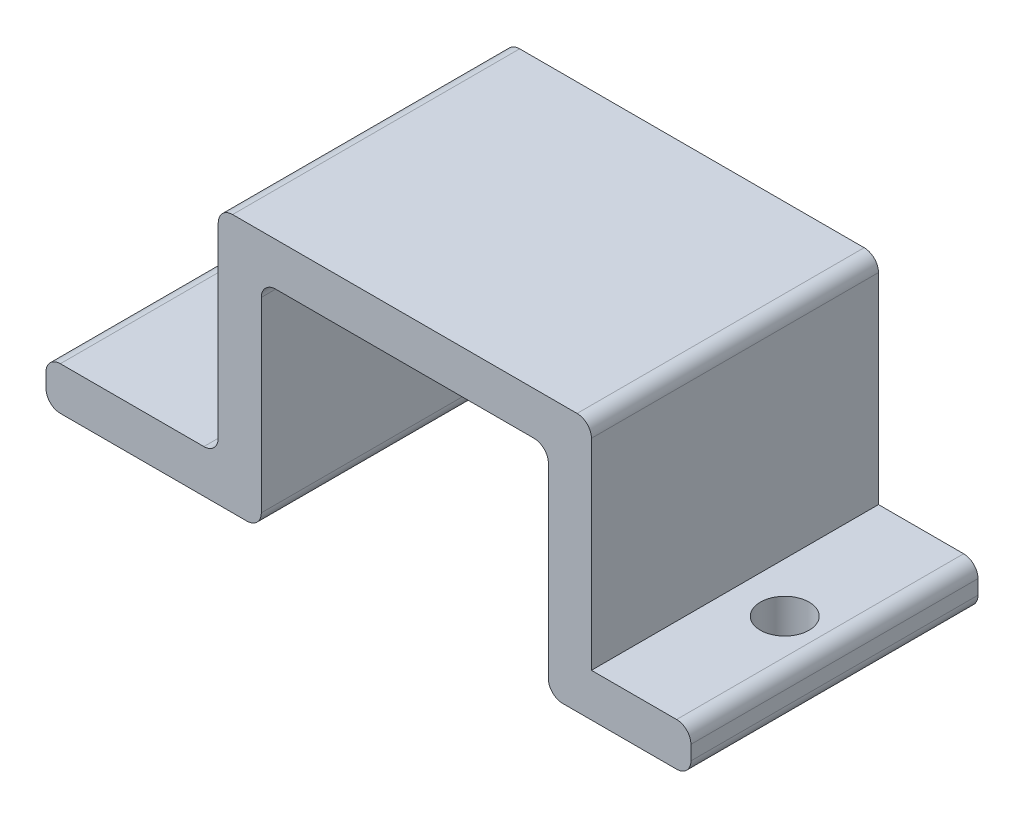
ISO-10303-21;
HEADER;
FILE_DESCRIPTION(('STEP AP214'),'2;1');
FILE_NAME('part.step','',(''),(''),'','','');
FILE_SCHEMA(('AUTOMOTIVE_DESIGN { 1 0 10303 214 1 1 1 1 }'));
ENDSEC;
DATA;
#1=APPLICATION_CONTEXT('core data for automotive mechanical design processes');
#2=APPLICATION_PROTOCOL_DEFINITION('international standard','automotive_design',2000,#1);
#3=PRODUCT_CONTEXT('',#1,'mechanical');
#4=PRODUCT('Part','Part','',(#3));
#5=PRODUCT_RELATED_PRODUCT_CATEGORY('part','',(#4));
#6=PRODUCT_DEFINITION_FORMATION('','',#4);
#7=PRODUCT_DEFINITION_CONTEXT('part definition',#1,'design');
#8=PRODUCT_DEFINITION('design','',#6,#7);
#9=PRODUCT_DEFINITION_SHAPE('','',#8);
#10=(LENGTH_UNIT() NAMED_UNIT(*) SI_UNIT(.MILLI.,.METRE.));
#11=(NAMED_UNIT(*) PLANE_ANGLE_UNIT() SI_UNIT($,.RADIAN.));
#12=(NAMED_UNIT(*) SI_UNIT($,.STERADIAN.) SOLID_ANGLE_UNIT());
#13=UNCERTAINTY_MEASURE_WITH_UNIT(LENGTH_MEASURE(1.E-05),#10,'distance_accuracy_value','');
#14=(GEOMETRIC_REPRESENTATION_CONTEXT(3) GLOBAL_UNCERTAINTY_ASSIGNED_CONTEXT((#13)) GLOBAL_UNIT_ASSIGNED_CONTEXT((#10,
#11,#12)) REPRESENTATION_CONTEXT('',''));
#15=CARTESIAN_POINT('',(0.,0.,0.));
#16=DIRECTION('',(0.,0.,1.));
#17=DIRECTION('',(1.,0.,0.));
#18=AXIS2_PLACEMENT_3D('',#15,#16,#17);
#19=CARTESIAN_POINT('',(0.,18.,20.));
#20=DIRECTION('',(1.,0.,0.));
#21=DIRECTION('',(0.,1.,0.));
#22=AXIS2_PLACEMENT_3D('',#19,#20,#21);
#23=PLANE('',#22);
#24=DIRECTION('',(0.,-1.,0.));
#25=VECTOR('',#24,1.);
#26=CARTESIAN_POINT('',(0.,18.,0.));
#27=LINE('',#26,#25);
#28=CARTESIAN_POINT('',(0.,17.,0.));
#29=VERTEX_POINT('',#28);
#30=CARTESIAN_POINT('',(0.,4.,0.));
#31=VERTEX_POINT('',#30);
#32=EDGE_CURVE('E241',#29,#31,#27,.T.);
#33=ORIENTED_EDGE('',*,*,#32,.T.);
#34=DIRECTION('',(0.,0.,-1.));
#35=VECTOR('',#34,1.);
#36=CARTESIAN_POINT('',(0.,4.,20.));
#37=LINE('',#36,#35);
#38=CARTESIAN_POINT('',(0.,4.,20.));
#39=VERTEX_POINT('',#38);
#40=EDGE_CURVE('E350',#31,#39,#37,.F.);
#41=ORIENTED_EDGE('',*,*,#40,.T.);
#42=DIRECTION('',(0.,-1.,0.));
#43=VECTOR('',#42,1.);
#44=CARTESIAN_POINT('',(0.,18.,20.));
#45=LINE('',#44,#43);
#46=CARTESIAN_POINT('',(0.,17.,20.));
#47=VERTEX_POINT('',#46);
#48=EDGE_CURVE('E253',#47,#39,#45,.T.);
#49=ORIENTED_EDGE('',*,*,#48,.F.);
#50=DIRECTION('',(0.,0.,-1.));
#51=VECTOR('',#50,1.);
#52=CARTESIAN_POINT('',(0.,17.,20.));
#53=LINE('',#52,#51);
#54=EDGE_CURVE('E347',#47,#29,#53,.T.);
#55=ORIENTED_EDGE('',*,*,#54,.T.);
#56=EDGE_LOOP('',(#33,#41,#49,#55));
#57=FACE_BOUND('',#56,.T.);
#58=ADVANCED_FACE('F39',(#57),#23,.F.);
#59=CARTESIAN_POINT('',(26.,0.,20.));
#60=DIRECTION('',(-1.,0.,0.));
#61=DIRECTION('',(0.,0.,1.));
#62=AXIS2_PLACEMENT_3D('',#59,#60,#61);
#63=PLANE('',#62);
#64=DIRECTION('',(0.,1.,0.));
#65=VECTOR('',#64,1.);
#66=CARTESIAN_POINT('',(26.,0.,0.));
#67=LINE('',#66,#65);
#68=CARTESIAN_POINT('',(26.,3.,0.));
#69=VERTEX_POINT('',#68);
#70=CARTESIAN_POINT('',(26.,17.,0.));
#71=VERTEX_POINT('',#70);
#72=EDGE_CURVE('E271',#69,#71,#67,.T.);
#73=ORIENTED_EDGE('',*,*,#72,.T.);
#74=DIRECTION('',(0.,0.,-1.));
#75=VECTOR('',#74,1.);
#76=CARTESIAN_POINT('',(26.,17.,20.));
#77=LINE('',#76,#75);
#78=CARTESIAN_POINT('',(26.,17.,20.));
#79=VERTEX_POINT('',#78);
#80=EDGE_CURVE('E203',#71,#79,#77,.F.);
#81=ORIENTED_EDGE('',*,*,#80,.T.);
#82=DIRECTION('',(0.,1.,0.));
#83=VECTOR('',#82,1.);
#84=CARTESIAN_POINT('',(26.,0.,20.));
#85=LINE('',#84,#83);
#86=CARTESIAN_POINT('',(26.,3.,20.));
#87=VERTEX_POINT('',#86);
#88=EDGE_CURVE('E195',#87,#79,#85,.T.);
#89=ORIENTED_EDGE('',*,*,#88,.F.);
#90=DIRECTION('',(0.,0.,1.));
#91=VECTOR('',#90,1.);
#92=CARTESIAN_POINT('',(26.,3.,0.));
#93=LINE('',#92,#91);
#94=EDGE_CURVE('E200',#69,#87,#93,.T.);
#95=ORIENTED_EDGE('',*,*,#94,.F.);
#96=EDGE_LOOP('',(#73,#81,#89,#95));
#97=FACE_BOUND('',#96,.T.);
#98=ADVANCED_FACE('F198',(#97),#63,.F.);
#99=CARTESIAN_POINT('',(0.,0.,20.));
#100=DIRECTION('',(0.,1.,0.));
#101=DIRECTION('',(0.,0.,1.));
#102=AXIS2_PLACEMENT_3D('',#99,#100,#101);
#103=PLANE('',#102);
#104=CARTESIAN_POINT('',(-6.,0.,10.));
#105=DIRECTION('',(0.,1.,0.));
#106=DIRECTION('',(0.,0.,1.));
#107=AXIS2_PLACEMENT_3D('',#104,#105,#106);
#108=CIRCLE('',#107,1.69999999999999);
#109=CARTESIAN_POINT('',(-6.,0.,11.7));
#110=VERTEX_POINT('',#109);
#111=EDGE_CURVE('E387',#110,#110,#108,.T.);
#112=ORIENTED_EDGE('',*,*,#111,.T.);
#113=EDGE_LOOP('',(#112));
#114=FACE_BOUND('',#113,.T.);
#115=DIRECTION('',(1.,0.,0.));
#116=VECTOR('',#115,1.);
#117=CARTESIAN_POINT('',(0.,0.,0.));
#118=LINE('',#117,#116);
#119=CARTESIAN_POINT('',(-11.,0.,0.));
#120=VERTEX_POINT('',#119);
#121=CARTESIAN_POINT('',(2.,0.,0.));
#122=VERTEX_POINT('',#121);
#123=EDGE_CURVE('E236',#120,#122,#118,.T.);
#124=ORIENTED_EDGE('',*,*,#123,.T.);
#125=DIRECTION('',(0.,0.,-1.));
#126=VECTOR('',#125,1.);
#127=CARTESIAN_POINT('',(2.,0.,20.));
#128=LINE('',#127,#126);
#129=CARTESIAN_POINT('',(2.,0.,20.));
#130=VERTEX_POINT('',#129);
#131=EDGE_CURVE('E335',#122,#130,#128,.F.);
#132=ORIENTED_EDGE('',*,*,#131,.T.);
#133=DIRECTION('',(1.,0.,0.));
#134=VECTOR('',#133,1.);
#135=CARTESIAN_POINT('',(0.,0.,20.));
#136=LINE('',#135,#134);
#137=CARTESIAN_POINT('',(-11.,0.,20.));
#138=VERTEX_POINT('',#137);
#139=EDGE_CURVE('E237',#138,#130,#136,.T.);
#140=ORIENTED_EDGE('',*,*,#139,.F.);
#141=DIRECTION('',(0.,0.,1.));
#142=VECTOR('',#141,1.);
#143=CARTESIAN_POINT('',(-11.,0.,20.));
#144=LINE('',#143,#142);
#145=EDGE_CURVE('E333',#138,#120,#144,.F.);
#146=ORIENTED_EDGE('',*,*,#145,.T.);
#147=EDGE_LOOP('',(#124,#132,#140,#146));
#148=FACE_BOUND('',#147,.T.);
#149=ADVANCED_FACE('F421',(#114,#148),#103,.F.);
#150=CARTESIAN_POINT('',(3.,0.,20.));
#151=DIRECTION('',(-1.,0.,0.));
#152=DIRECTION('',(0.,0.,1.));
#153=AXIS2_PLACEMENT_3D('',#150,#151,#152);
#154=PLANE('',#153);
#155=DIRECTION('',(0.,1.,0.));
#156=VECTOR('',#155,1.);
#157=CARTESIAN_POINT('',(3.,0.,0.));
#158=LINE('',#157,#156);
#159=CARTESIAN_POINT('',(3.,1.,0.));
#160=VERTEX_POINT('',#159);
#161=CARTESIAN_POINT('',(3.,14.,0.));
#162=VERTEX_POINT('',#161);
#163=EDGE_CURVE('E259',#160,#162,#158,.T.);
#164=ORIENTED_EDGE('',*,*,#163,.T.);
#165=DIRECTION('',(0.,0.,-1.));
#166=VECTOR('',#165,1.);
#167=CARTESIAN_POINT('',(3.,14.,20.));
#168=LINE('',#167,#166);
#169=CARTESIAN_POINT('',(3.,14.,20.));
#170=VERTEX_POINT('',#169);
#171=EDGE_CURVE('E326',#162,#170,#168,.F.);
#172=ORIENTED_EDGE('',*,*,#171,.T.);
#173=DIRECTION('',(0.,1.,0.));
#174=VECTOR('',#173,1.);
#175=CARTESIAN_POINT('',(3.,0.,20.));
#176=LINE('',#175,#174);
#177=CARTESIAN_POINT('',(3.,1.,20.));
#178=VERTEX_POINT('',#177);
#179=EDGE_CURVE('E240',#178,#170,#176,.T.);
#180=ORIENTED_EDGE('',*,*,#179,.F.);
#181=DIRECTION('',(0.,0.,-1.));
#182=VECTOR('',#181,1.);
#183=CARTESIAN_POINT('',(3.,1.,20.));
#184=LINE('',#183,#182);
#185=EDGE_CURVE('E323',#178,#160,#184,.T.);
#186=ORIENTED_EDGE('',*,*,#185,.T.);
#187=EDGE_LOOP('',(#164,#172,#180,#186));
#188=FACE_BOUND('',#187,.T.);
#189=ADVANCED_FACE('F441',(#188),#154,.F.);
#190=CARTESIAN_POINT('',(3.,15.,20.));
#191=DIRECTION('',(0.,1.,0.));
#192=DIRECTION('',(0.,0.,1.));
#193=AXIS2_PLACEMENT_3D('',#190,#191,#192);
#194=PLANE('',#193);
#195=DIRECTION('',(1.,0.,0.));
#196=VECTOR('',#195,1.);
#197=CARTESIAN_POINT('',(3.,15.,20.));
#198=LINE('',#197,#196);
#199=CARTESIAN_POINT('',(4.,15.,20.));
#200=VERTEX_POINT('',#199);
#201=CARTESIAN_POINT('',(22.,15.,20.));
#202=VERTEX_POINT('',#201);
#203=EDGE_CURVE('E244',#200,#202,#198,.T.);
#204=ORIENTED_EDGE('',*,*,#203,.F.);
#205=DIRECTION('',(0.,0.,-1.));
#206=VECTOR('',#205,1.);
#207=CARTESIAN_POINT('',(4.,15.,0.));
#208=LINE('',#207,#206);
#209=CARTESIAN_POINT('',(4.,15.,0.));
#210=VERTEX_POINT('',#209);
#211=EDGE_CURVE('E320',#200,#210,#208,.T.);
#212=ORIENTED_EDGE('',*,*,#211,.T.);
#213=DIRECTION('',(1.,0.,0.));
#214=VECTOR('',#213,1.);
#215=CARTESIAN_POINT('',(3.,15.,0.));
#216=LINE('',#215,#214);
#217=CARTESIAN_POINT('',(22.,15.,0.));
#218=VERTEX_POINT('',#217);
#219=EDGE_CURVE('E262',#210,#218,#216,.T.);
#220=ORIENTED_EDGE('',*,*,#219,.T.);
#221=DIRECTION('',(0.,0.,-1.));
#222=VECTOR('',#221,1.);
#223=CARTESIAN_POINT('',(22.,15.,20.));
#224=LINE('',#223,#222);
#225=EDGE_CURVE('E318',#218,#202,#224,.F.);
#226=ORIENTED_EDGE('',*,*,#225,.T.);
#227=EDGE_LOOP('',(#204,#212,#220,#226));
#228=FACE_BOUND('',#227,.T.);
#229=ADVANCED_FACE('F437',(#228),#194,.F.);
#230=CARTESIAN_POINT('',(23.,15.,20.));
#231=DIRECTION('',(1.,0.,0.));
#232=DIRECTION('',(0.,0.,-1.));
#233=AXIS2_PLACEMENT_3D('',#230,#231,#232);
#234=PLANE('',#233);
#235=DIRECTION('',(0.,-1.,0.));
#236=VECTOR('',#235,1.);
#237=CARTESIAN_POINT('',(23.,15.,20.));
#238=LINE('',#237,#236);
#239=CARTESIAN_POINT('',(23.,14.,20.));
#240=VERTEX_POINT('',#239);
#241=CARTESIAN_POINT('',(23.,1.,20.));
#242=VERTEX_POINT('',#241);
#243=EDGE_CURVE('E247',#240,#242,#238,.T.);
#244=ORIENTED_EDGE('',*,*,#243,.F.);
#245=DIRECTION('',(0.,0.,-1.));
#246=VECTOR('',#245,1.);
#247=CARTESIAN_POINT('',(23.,14.,0.));
#248=LINE('',#247,#246);
#249=CARTESIAN_POINT('',(23.,14.,0.));
#250=VERTEX_POINT('',#249);
#251=EDGE_CURVE('E330',#240,#250,#248,.T.);
#252=ORIENTED_EDGE('',*,*,#251,.T.);
#253=DIRECTION('',(0.,-1.,0.));
#254=VECTOR('',#253,1.);
#255=CARTESIAN_POINT('',(23.,15.,0.));
#256=LINE('',#255,#254);
#257=CARTESIAN_POINT('',(23.,1.,0.));
#258=VERTEX_POINT('',#257);
#259=EDGE_CURVE('E265',#250,#258,#256,.T.);
#260=ORIENTED_EDGE('',*,*,#259,.T.);
#261=DIRECTION('',(0.,0.,-1.));
#262=VECTOR('',#261,1.);
#263=CARTESIAN_POINT('',(23.,1.,20.));
#264=LINE('',#263,#262);
#265=EDGE_CURVE('E328',#258,#242,#264,.F.);
#266=ORIENTED_EDGE('',*,*,#265,.T.);
#267=EDGE_LOOP('',(#244,#252,#260,#266));
#268=FACE_BOUND('',#267,.T.);
#269=ADVANCED_FACE('F433',(#268),#234,.F.);
#270=CARTESIAN_POINT('',(23.,0.,20.));
#271=DIRECTION('',(0.,1.,0.));
#272=DIRECTION('',(0.,0.,1.));
#273=AXIS2_PLACEMENT_3D('',#270,#271,#272);
#274=PLANE('',#273);
#275=CARTESIAN_POINT('',(29.4658367165777,0.,10.));
#276=DIRECTION('',(0.,1.,0.));
#277=DIRECTION('',(0.,0.,1.));
#278=AXIS2_PLACEMENT_3D('',#275,#276,#277);
#279=CIRCLE('',#278,1.7);
#280=CARTESIAN_POINT('',(29.4658367165777,0.,11.7));
#281=VERTEX_POINT('',#280);
#282=EDGE_CURVE('E393',#281,#281,#279,.T.);
#283=ORIENTED_EDGE('',*,*,#282,.T.);
#284=EDGE_LOOP('',(#283));
#285=FACE_BOUND('',#284,.T.);
#286=DIRECTION('',(1.,0.,0.));
#287=VECTOR('',#286,1.);
#288=CARTESIAN_POINT('',(23.,0.,0.));
#289=LINE('',#288,#287);
#290=CARTESIAN_POINT('',(24.,0.,0.));
#291=VERTEX_POINT('',#290);
#292=CARTESIAN_POINT('',(31.9316734331555,0.,0.));
#293=VERTEX_POINT('',#292);
#294=EDGE_CURVE('E268',#291,#293,#289,.T.);
#295=ORIENTED_EDGE('',*,*,#294,.T.);
#296=DIRECTION('',(0.,0.,-1.));
#297=VECTOR('',#296,1.);
#298=CARTESIAN_POINT('',(31.9316734331555,0.,20.));
#299=LINE('',#298,#297);
#300=CARTESIAN_POINT('',(31.9316734331555,0.,20.));
#301=VERTEX_POINT('',#300);
#302=EDGE_CURVE('E301',#293,#301,#299,.F.);
#303=ORIENTED_EDGE('',*,*,#302,.T.);
#304=DIRECTION('',(1.,0.,0.));
#305=VECTOR('',#304,1.);
#306=CARTESIAN_POINT('',(23.,0.,20.));
#307=LINE('',#306,#305);
#308=CARTESIAN_POINT('',(24.,0.,20.));
#309=VERTEX_POINT('',#308);
#310=EDGE_CURVE('E206',#309,#301,#307,.T.);
#311=ORIENTED_EDGE('',*,*,#310,.F.);
#312=DIRECTION('',(0.,0.,-1.));
#313=VECTOR('',#312,1.);
#314=CARTESIAN_POINT('',(24.,0.,20.));
#315=LINE('',#314,#313);
#316=EDGE_CURVE('E298',#309,#291,#315,.T.);
#317=ORIENTED_EDGE('',*,*,#316,.T.);
#318=EDGE_LOOP('',(#295,#303,#311,#317));
#319=FACE_BOUND('',#318,.T.);
#320=ADVANCED_FACE('F428',(#285,#319),#274,.F.);
#321=CARTESIAN_POINT('',(26.,18.,20.));
#322=DIRECTION('',(0.,-1.,0.));
#323=DIRECTION('',(1.,0.,0.));
#324=AXIS2_PLACEMENT_3D('',#321,#322,#323);
#325=PLANE('',#324);
#326=DIRECTION('',(-1.,0.,0.));
#327=VECTOR('',#326,1.);
#328=CARTESIAN_POINT('',(26.,18.,0.));
#329=LINE('',#328,#327);
#330=CARTESIAN_POINT('',(25.,18.,0.));
#331=VERTEX_POINT('',#330);
#332=CARTESIAN_POINT('',(1.,18.,0.));
#333=VERTEX_POINT('',#332);
#334=EDGE_CURVE('E273',#331,#333,#329,.T.);
#335=ORIENTED_EDGE('',*,*,#334,.T.);
#336=DIRECTION('',(0.,0.,-1.));
#337=VECTOR('',#336,1.);
#338=CARTESIAN_POINT('',(1.,18.,20.));
#339=LINE('',#338,#337);
#340=CARTESIAN_POINT('',(1.,18.,20.));
#341=VERTEX_POINT('',#340);
#342=EDGE_CURVE('E355',#333,#341,#339,.F.);
#343=ORIENTED_EDGE('',*,*,#342,.T.);
#344=DIRECTION('',(-1.,0.,0.));
#345=VECTOR('',#344,1.);
#346=CARTESIAN_POINT('',(26.,18.,20.));
#347=LINE('',#346,#345);
#348=CARTESIAN_POINT('',(25.,18.,20.));
#349=VERTEX_POINT('',#348);
#350=EDGE_CURVE('E205',#349,#341,#347,.T.);
#351=ORIENTED_EDGE('',*,*,#350,.F.);
#352=DIRECTION('',(0.,0.,-1.));
#353=VECTOR('',#352,1.);
#354=CARTESIAN_POINT('',(25.,18.,20.));
#355=LINE('',#354,#353);
#356=EDGE_CURVE('E352',#349,#331,#355,.T.);
#357=ORIENTED_EDGE('',*,*,#356,.T.);
#358=EDGE_LOOP('',(#335,#343,#351,#357));
#359=FACE_BOUND('',#358,.T.);
#360=ADVANCED_FACE('F426',(#359),#325,.F.);
#361=CARTESIAN_POINT('',(0.,0.,20.));
#362=DIRECTION('',(0.,0.,1.));
#363=DIRECTION('',(1.,0.,0.));
#364=AXIS2_PLACEMENT_3D('',#361,#362,#363);
#365=PLANE('',#364);
#366=ORIENTED_EDGE('',*,*,#310,.T.);
#367=CARTESIAN_POINT('',(31.9316734331555,1.,20.));
#368=DIRECTION('',(0.,0.,1.));
#369=DIRECTION('',(1.,0.,0.));
#370=AXIS2_PLACEMENT_3D('',#367,#368,#369);
#371=CIRCLE('',#370,1.);
#372=CARTESIAN_POINT('',(32.9316734331555,1.,20.));
#373=VERTEX_POINT('',#372);
#374=EDGE_CURVE('E314',#301,#373,#371,.T.);
#375=ORIENTED_EDGE('',*,*,#374,.T.);
#376=DIRECTION('',(0.,-1.,0.));
#377=VECTOR('',#376,1.);
#378=CARTESIAN_POINT('',(32.9316734331555,3.,20.));
#379=LINE('',#378,#377);
#380=CARTESIAN_POINT('',(32.9316734331555,2.,20.));
#381=VERTEX_POINT('',#380);
#382=EDGE_CURVE('E233',#381,#373,#379,.T.);
#383=ORIENTED_EDGE('',*,*,#382,.F.);
#384=CARTESIAN_POINT('',(31.9316734331555,2.,20.));
#385=DIRECTION('',(0.,0.,1.));
#386=DIRECTION('',(1.,0.,0.));
#387=AXIS2_PLACEMENT_3D('',#384,#385,#386);
#388=CIRCLE('',#387,1.);
#389=CARTESIAN_POINT('',(31.9316734331555,3.,20.));
#390=VERTEX_POINT('',#389);
#391=EDGE_CURVE('E214',#381,#390,#388,.T.);
#392=ORIENTED_EDGE('',*,*,#391,.T.);
#393=DIRECTION('',(1.,0.,0.));
#394=VECTOR('',#393,1.);
#395=CARTESIAN_POINT('',(26.,3.,20.));
#396=LINE('',#395,#394);
#397=EDGE_CURVE('E209',#87,#390,#396,.T.);
#398=ORIENTED_EDGE('',*,*,#397,.F.);
#399=ORIENTED_EDGE('',*,*,#88,.T.);
#400=CARTESIAN_POINT('',(25.,17.,20.));
#401=DIRECTION('',(0.,0.,1.));
#402=DIRECTION('',(1.,0.,0.));
#403=AXIS2_PLACEMENT_3D('',#400,#401,#402);
#404=CIRCLE('',#403,1.);
#405=EDGE_CURVE('E303',#79,#349,#404,.T.);
#406=ORIENTED_EDGE('',*,*,#405,.T.);
#407=ORIENTED_EDGE('',*,*,#350,.T.);
#408=CARTESIAN_POINT('',(1.,17.,20.));
#409=DIRECTION('',(0.,0.,1.));
#410=DIRECTION('',(1.,0.,0.));
#411=AXIS2_PLACEMENT_3D('',#408,#409,#410);
#412=CIRCLE('',#411,1.);
#413=EDGE_CURVE('E305',#341,#47,#412,.T.);
#414=ORIENTED_EDGE('',*,*,#413,.T.);
#415=ORIENTED_EDGE('',*,*,#48,.T.);
#416=CARTESIAN_POINT('',(-1.,4.,20.));
#417=DIRECTION('',(0.,0.,1.));
#418=DIRECTION('',(1.,0.,0.));
#419=AXIS2_PLACEMENT_3D('',#416,#417,#418);
#420=CIRCLE('',#419,1.);
#421=CARTESIAN_POINT('',(-1.,3.,20.));
#422=VERTEX_POINT('',#421);
#423=EDGE_CURVE('E11',#39,#422,#420,.F.);
#424=ORIENTED_EDGE('',*,*,#423,.T.);
#425=DIRECTION('',(1.,0.,0.));
#426=VECTOR('',#425,1.);
#427=CARTESIAN_POINT('',(0.,3.,20.));
#428=LINE('',#427,#426);
#429=CARTESIAN_POINT('',(-11.,3.,20.));
#430=VERTEX_POINT('',#429);
#431=EDGE_CURVE('E225',#430,#422,#428,.T.);
#432=ORIENTED_EDGE('',*,*,#431,.F.);
#433=CARTESIAN_POINT('',(-11.,2.,20.));
#434=DIRECTION('',(0.,0.,1.));
#435=DIRECTION('',(1.,0.,0.));
#436=AXIS2_PLACEMENT_3D('',#433,#434,#435);
#437=CIRCLE('',#436,1.);
#438=CARTESIAN_POINT('',(-12.,2.,20.));
#439=VERTEX_POINT('',#438);
#440=EDGE_CURVE('E62',#430,#439,#437,.T.);
#441=ORIENTED_EDGE('',*,*,#440,.T.);
#442=DIRECTION('',(0.,-1.,0.));
#443=VECTOR('',#442,1.);
#444=CARTESIAN_POINT('',(-12.,3.,20.));
#445=LINE('',#444,#443);
#446=CARTESIAN_POINT('',(-12.,1.,20.));
#447=VERTEX_POINT('',#446);
#448=EDGE_CURVE('E381',#439,#447,#445,.T.);
#449=ORIENTED_EDGE('',*,*,#448,.T.);
#450=CARTESIAN_POINT('',(-11.,1.,20.));
#451=DIRECTION('',(0.,0.,1.));
#452=DIRECTION('',(1.,0.,0.));
#453=AXIS2_PLACEMENT_3D('',#450,#451,#452);
#454=CIRCLE('',#453,1.);
#455=EDGE_CURVE('E54',#447,#138,#454,.T.);
#456=ORIENTED_EDGE('',*,*,#455,.T.);
#457=ORIENTED_EDGE('',*,*,#139,.T.);
#458=CARTESIAN_POINT('',(2.,1.,20.));
#459=DIRECTION('',(0.,0.,1.));
#460=DIRECTION('',(1.,0.,0.));
#461=AXIS2_PLACEMENT_3D('',#458,#459,#460);
#462=CIRCLE('',#461,1.);
#463=EDGE_CURVE('E311',#130,#178,#462,.T.);
#464=ORIENTED_EDGE('',*,*,#463,.T.);
#465=ORIENTED_EDGE('',*,*,#179,.T.);
#466=CARTESIAN_POINT('',(4.,14.,20.));
#467=DIRECTION('',(0.,0.,1.));
#468=DIRECTION('',(1.,0.,0.));
#469=AXIS2_PLACEMENT_3D('',#466,#467,#468);
#470=CIRCLE('',#469,1.);
#471=EDGE_CURVE('E360',#170,#200,#470,.F.);
#472=ORIENTED_EDGE('',*,*,#471,.T.);
#473=ORIENTED_EDGE('',*,*,#203,.T.);
#474=CARTESIAN_POINT('',(22.,14.,20.));
#475=DIRECTION('',(0.,0.,1.));
#476=DIRECTION('',(1.,0.,0.));
#477=AXIS2_PLACEMENT_3D('',#474,#475,#476);
#478=CIRCLE('',#477,1.);
#479=EDGE_CURVE('E364',#202,#240,#478,.F.);
#480=ORIENTED_EDGE('',*,*,#479,.T.);
#481=ORIENTED_EDGE('',*,*,#243,.T.);
#482=CARTESIAN_POINT('',(24.,1.,20.));
#483=DIRECTION('',(0.,0.,1.));
#484=DIRECTION('',(1.,0.,0.));
#485=AXIS2_PLACEMENT_3D('',#482,#483,#484);
#486=CIRCLE('',#485,1.);
#487=EDGE_CURVE('E307',#242,#309,#486,.T.);
#488=ORIENTED_EDGE('',*,*,#487,.T.);
#489=EDGE_LOOP('',(#366,#375,#383,#392,#398,#399,#406,#407,#414,#415,#424,#432,#441,#449,#456,
#457,#464,#465,#472,#473,#480,#481,#488));
#490=FACE_BOUND('',#489,.T.);
#491=ADVANCED_FACE('F211',(#490),#365,.T.);
#492=CARTESIAN_POINT('',(0.,0.,0.));
#493=DIRECTION('',(0.,0.,1.));
#494=DIRECTION('',(1.,0.,0.));
#495=AXIS2_PLACEMENT_3D('',#492,#493,#494);
#496=PLANE('',#495);
#497=DIRECTION('',(0.,-1.,0.));
#498=VECTOR('',#497,1.);
#499=CARTESIAN_POINT('',(32.9316734331555,3.,0.));
#500=LINE('',#499,#498);
#501=CARTESIAN_POINT('',(32.9316734331555,2.,0.));
#502=VERTEX_POINT('',#501);
#503=CARTESIAN_POINT('',(32.9316734331555,1.,0.));
#504=VERTEX_POINT('',#503);
#505=EDGE_CURVE('E230',#502,#504,#500,.T.);
#506=ORIENTED_EDGE('',*,*,#505,.T.);
#507=CARTESIAN_POINT('',(31.9316734331555,1.,0.));
#508=DIRECTION('',(0.,0.,1.));
#509=DIRECTION('',(1.,0.,0.));
#510=AXIS2_PLACEMENT_3D('',#507,#508,#509);
#511=CIRCLE('',#510,1.);
#512=EDGE_CURVE('E296',#504,#293,#511,.F.);
#513=ORIENTED_EDGE('',*,*,#512,.T.);
#514=ORIENTED_EDGE('',*,*,#294,.F.);
#515=CARTESIAN_POINT('',(24.,1.,0.));
#516=DIRECTION('',(0.,0.,1.));
#517=DIRECTION('',(1.,0.,0.));
#518=AXIS2_PLACEMENT_3D('',#515,#516,#517);
#519=CIRCLE('',#518,1.);
#520=EDGE_CURVE('E286',#291,#258,#519,.F.);
#521=ORIENTED_EDGE('',*,*,#520,.T.);
#522=ORIENTED_EDGE('',*,*,#259,.F.);
#523=CARTESIAN_POINT('',(22.,14.,0.));
#524=DIRECTION('',(0.,0.,1.));
#525=DIRECTION('',(1.,0.,0.));
#526=AXIS2_PLACEMENT_3D('',#523,#524,#525);
#527=CIRCLE('',#526,1.);
#528=EDGE_CURVE('E362',#250,#218,#527,.T.);
#529=ORIENTED_EDGE('',*,*,#528,.T.);
#530=ORIENTED_EDGE('',*,*,#219,.F.);
#531=CARTESIAN_POINT('',(4.,14.,0.));
#532=DIRECTION('',(0.,0.,1.));
#533=DIRECTION('',(1.,0.,0.));
#534=AXIS2_PLACEMENT_3D('',#531,#532,#533);
#535=CIRCLE('',#534,1.);
#536=EDGE_CURVE('E358',#210,#162,#535,.T.);
#537=ORIENTED_EDGE('',*,*,#536,.T.);
#538=ORIENTED_EDGE('',*,*,#163,.F.);
#539=CARTESIAN_POINT('',(2.,1.,0.));
#540=DIRECTION('',(0.,0.,1.));
#541=DIRECTION('',(1.,0.,0.));
#542=AXIS2_PLACEMENT_3D('',#539,#540,#541);
#543=CIRCLE('',#542,1.);
#544=EDGE_CURVE('E292',#160,#122,#543,.F.);
#545=ORIENTED_EDGE('',*,*,#544,.T.);
#546=ORIENTED_EDGE('',*,*,#123,.F.);
#547=CARTESIAN_POINT('',(-11.,1.,0.));
#548=DIRECTION('',(0.,0.,1.));
#549=DIRECTION('',(1.,0.,0.));
#550=AXIS2_PLACEMENT_3D('',#547,#548,#549);
#551=CIRCLE('',#550,1.);
#552=CARTESIAN_POINT('',(-12.,1.,0.));
#553=VERTEX_POINT('',#552);
#554=EDGE_CURVE('E290',#120,#553,#551,.F.);
#555=ORIENTED_EDGE('',*,*,#554,.T.);
#556=DIRECTION('',(0.,-1.,0.));
#557=VECTOR('',#556,1.);
#558=CARTESIAN_POINT('',(-12.,3.,0.));
#559=LINE('',#558,#557);
#560=CARTESIAN_POINT('',(-12.,2.,0.));
#561=VERTEX_POINT('',#560);
#562=EDGE_CURVE('E382',#561,#553,#559,.T.);
#563=ORIENTED_EDGE('',*,*,#562,.F.);
#564=CARTESIAN_POINT('',(-11.,2.,0.));
#565=DIRECTION('',(0.,0.,1.));
#566=DIRECTION('',(1.,0.,0.));
#567=AXIS2_PLACEMENT_3D('',#564,#565,#566);
#568=CIRCLE('',#567,1.);
#569=CARTESIAN_POINT('',(-11.,3.,0.));
#570=VERTEX_POINT('',#569);
#571=EDGE_CURVE('E288',#561,#570,#568,.F.);
#572=ORIENTED_EDGE('',*,*,#571,.T.);
#573=DIRECTION('',(-1.,0.,0.));
#574=VECTOR('',#573,1.);
#575=CARTESIAN_POINT('',(0.,3.,0.));
#576=LINE('',#575,#574);
#577=CARTESIAN_POINT('',(-1.,3.,0.));
#578=VERTEX_POINT('',#577);
#579=EDGE_CURVE('E222',#578,#570,#576,.T.);
#580=ORIENTED_EDGE('',*,*,#579,.F.);
#581=CARTESIAN_POINT('',(-1.,4.,0.));
#582=DIRECTION('',(0.,0.,1.));
#583=DIRECTION('',(1.,0.,0.));
#584=AXIS2_PLACEMENT_3D('',#581,#582,#583);
#585=CIRCLE('',#584,1.);
#586=EDGE_CURVE('E47',#578,#31,#585,.T.);
#587=ORIENTED_EDGE('',*,*,#586,.T.);
#588=ORIENTED_EDGE('',*,*,#32,.F.);
#589=CARTESIAN_POINT('',(1.,17.,0.));
#590=DIRECTION('',(0.,0.,1.));
#591=DIRECTION('',(1.,0.,0.));
#592=AXIS2_PLACEMENT_3D('',#589,#590,#591);
#593=CIRCLE('',#592,1.);
#594=EDGE_CURVE('E284',#29,#333,#593,.F.);
#595=ORIENTED_EDGE('',*,*,#594,.T.);
#596=ORIENTED_EDGE('',*,*,#334,.F.);
#597=CARTESIAN_POINT('',(25.,17.,0.));
#598=DIRECTION('',(0.,0.,1.));
#599=DIRECTION('',(1.,0.,0.));
#600=AXIS2_PLACEMENT_3D('',#597,#598,#599);
#601=CIRCLE('',#600,1.);
#602=EDGE_CURVE('E282',#331,#71,#601,.F.);
#603=ORIENTED_EDGE('',*,*,#602,.T.);
#604=ORIENTED_EDGE('',*,*,#72,.F.);
#605=DIRECTION('',(-1.,0.,0.));
#606=VECTOR('',#605,1.);
#607=CARTESIAN_POINT('',(26.,3.,0.));
#608=LINE('',#607,#606);
#609=CARTESIAN_POINT('',(31.9316734331555,3.,0.));
#610=VERTEX_POINT('',#609);
#611=EDGE_CURVE('E218',#610,#69,#608,.T.);
#612=ORIENTED_EDGE('',*,*,#611,.F.);
#613=CARTESIAN_POINT('',(31.9316734331555,2.,0.));
#614=DIRECTION('',(0.,0.,1.));
#615=DIRECTION('',(1.,0.,0.));
#616=AXIS2_PLACEMENT_3D('',#613,#614,#615);
#617=CIRCLE('',#616,1.);
#618=EDGE_CURVE('E294',#610,#502,#617,.F.);
#619=ORIENTED_EDGE('',*,*,#618,.T.);
#620=EDGE_LOOP('',(#506,#513,#514,#521,#522,#529,#530,#537,#538,#545,#546,#555,#563,#572,#580,
#587,#588,#595,#596,#603,#604,#612,#619));
#621=FACE_BOUND('',#620,.T.);
#622=ADVANCED_FACE('F368',(#621),#496,.F.);
#623=CARTESIAN_POINT('',(32.9316734331555,3.,0.));
#624=DIRECTION('',(-1.,0.,0.));
#625=DIRECTION('',(0.,0.,1.));
#626=AXIS2_PLACEMENT_3D('',#623,#624,#625);
#627=PLANE('',#626);
#628=ORIENTED_EDGE('',*,*,#382,.T.);
#629=DIRECTION('',(0.,0.,-1.));
#630=VECTOR('',#629,1.);
#631=CARTESIAN_POINT('',(32.9316734331555,1.,0.));
#632=LINE('',#631,#630);
#633=EDGE_CURVE('E279',#373,#504,#632,.T.);
#634=ORIENTED_EDGE('',*,*,#633,.T.);
#635=ORIENTED_EDGE('',*,*,#505,.F.);
#636=DIRECTION('',(0.,0.,-1.));
#637=VECTOR('',#636,1.);
#638=CARTESIAN_POINT('',(32.9316734331555,2.,20.));
#639=LINE('',#638,#637);
#640=EDGE_CURVE('E256',#502,#381,#639,.F.);
#641=ORIENTED_EDGE('',*,*,#640,.T.);
#642=EDGE_LOOP('',(#628,#634,#635,#641));
#643=FACE_BOUND('',#642,.T.);
#644=ADVANCED_FACE('F404',(#643),#627,.F.);
#645=CARTESIAN_POINT('',(0.,3.,0.));
#646=DIRECTION('',(0.,1.,0.));
#647=DIRECTION('',(0.,0.,1.));
#648=AXIS2_PLACEMENT_3D('',#645,#646,#647);
#649=PLANE('',#648);
#650=CARTESIAN_POINT('',(29.4658367165777,3.,10.));
#651=DIRECTION('',(0.,1.,0.));
#652=DIRECTION('',(0.,0.,1.));
#653=AXIS2_PLACEMENT_3D('',#650,#651,#652);
#654=CIRCLE('',#653,1.69999999999999);
#655=CARTESIAN_POINT('',(29.4658367165777,3.,11.7));
#656=VERTEX_POINT('',#655);
#657=EDGE_CURVE('E396',#656,#656,#654,.T.);
#658=ORIENTED_EDGE('',*,*,#657,.F.);
#659=EDGE_LOOP('',(#658));
#660=FACE_BOUND('',#659,.T.);
#661=ORIENTED_EDGE('',*,*,#397,.T.);
#662=DIRECTION('',(0.,0.,-1.));
#663=VECTOR('',#662,1.);
#664=CARTESIAN_POINT('',(31.9316734331555,3.,0.));
#665=LINE('',#664,#663);
#666=EDGE_CURVE('E316',#390,#610,#665,.T.);
#667=ORIENTED_EDGE('',*,*,#666,.T.);
#668=ORIENTED_EDGE('',*,*,#611,.T.);
#669=ORIENTED_EDGE('',*,*,#94,.T.);
#670=EDGE_LOOP('',(#661,#667,#668,#669));
#671=FACE_BOUND('',#670,.T.);
#672=ADVANCED_FACE('F220',(#660,#671),#649,.T.);
#673=CARTESIAN_POINT('',(-12.,3.,20.));
#674=DIRECTION('',(1.,0.,0.));
#675=DIRECTION('',(0.,0.,-1.));
#676=AXIS2_PLACEMENT_3D('',#673,#674,#675);
#677=PLANE('',#676);
#678=ORIENTED_EDGE('',*,*,#562,.T.);
#679=DIRECTION('',(0.,0.,1.));
#680=VECTOR('',#679,1.);
#681=CARTESIAN_POINT('',(-12.,1.,20.));
#682=LINE('',#681,#680);
#683=EDGE_CURVE('E339',#553,#447,#682,.T.);
#684=ORIENTED_EDGE('',*,*,#683,.T.);
#685=ORIENTED_EDGE('',*,*,#448,.F.);
#686=DIRECTION('',(0.,0.,1.));
#687=VECTOR('',#686,1.);
#688=CARTESIAN_POINT('',(-12.,2.,0.));
#689=LINE('',#688,#687);
#690=EDGE_CURVE('E337',#439,#561,#689,.F.);
#691=ORIENTED_EDGE('',*,*,#690,.T.);
#692=EDGE_LOOP('',(#678,#684,#685,#691));
#693=FACE_BOUND('',#692,.T.);
#694=ADVANCED_FACE('F403',(#693),#677,.F.);
#695=CARTESIAN_POINT('',(0.,3.,0.));
#696=DIRECTION('',(0.,1.,0.));
#697=DIRECTION('',(0.,0.,1.));
#698=AXIS2_PLACEMENT_3D('',#695,#696,#697);
#699=PLANE('',#698);
#700=CARTESIAN_POINT('',(-6.,3.,10.));
#701=DIRECTION('',(0.,1.,0.));
#702=DIRECTION('',(0.,0.,1.));
#703=AXIS2_PLACEMENT_3D('',#700,#701,#702);
#704=CIRCLE('',#703,1.69999999999999);
#705=CARTESIAN_POINT('',(-6.,3.,11.7));
#706=VERTEX_POINT('',#705);
#707=EDGE_CURVE('E390',#706,#706,#704,.T.);
#708=ORIENTED_EDGE('',*,*,#707,.F.);
#709=EDGE_LOOP('',(#708));
#710=FACE_BOUND('',#709,.T.);
#711=ORIENTED_EDGE('',*,*,#579,.T.);
#712=DIRECTION('',(0.,0.,1.));
#713=VECTOR('',#712,1.);
#714=CARTESIAN_POINT('',(-11.,3.,20.));
#715=LINE('',#714,#713);
#716=EDGE_CURVE('E344',#570,#430,#715,.T.);
#717=ORIENTED_EDGE('',*,*,#716,.T.);
#718=ORIENTED_EDGE('',*,*,#431,.T.);
#719=DIRECTION('',(0.,0.,-1.));
#720=VECTOR('',#719,1.);
#721=CARTESIAN_POINT('',(-1.,3.,0.));
#722=LINE('',#721,#720);
#723=EDGE_CURVE('E341',#422,#578,#722,.T.);
#724=ORIENTED_EDGE('',*,*,#723,.T.);
#725=EDGE_LOOP('',(#711,#717,#718,#724));
#726=FACE_BOUND('',#725,.T.);
#727=ADVANCED_FACE('F379',(#710,#726),#699,.T.);
#728=CARTESIAN_POINT('',(-6.,3.,10.));
#729=DIRECTION('',(0.,1.,0.));
#730=DIRECTION('',(0.,0.,1.));
#731=AXIS2_PLACEMENT_3D('',#728,#729,#730);
#732=CYLINDRICAL_SURFACE('',#731,1.69999999999999);
#733=ORIENTED_EDGE('',*,*,#111,.F.);
#734=EDGE_LOOP('',(#733));
#735=FACE_BOUND('',#734,.T.);
#736=ORIENTED_EDGE('',*,*,#707,.T.);
#737=EDGE_LOOP('',(#736));
#738=FACE_BOUND('',#737,.T.);
#739=ADVANCED_FACE('F596',(#735,#738),#732,.F.);
#740=CARTESIAN_POINT('',(29.4658367165777,3.,10.));
#741=DIRECTION('',(0.,1.,0.));
#742=DIRECTION('',(0.,0.,1.));
#743=AXIS2_PLACEMENT_3D('',#740,#741,#742);
#744=CYLINDRICAL_SURFACE('',#743,1.69999999999999);
#745=ORIENTED_EDGE('',*,*,#282,.F.);
#746=EDGE_LOOP('',(#745));
#747=FACE_BOUND('',#746,.T.);
#748=ORIENTED_EDGE('',*,*,#657,.T.);
#749=EDGE_LOOP('',(#748));
#750=FACE_BOUND('',#749,.T.);
#751=ADVANCED_FACE('F400',(#747,#750),#744,.F.);
#752=CARTESIAN_POINT('',(31.9316734331555,1.,0.));
#753=DIRECTION('',(0.,0.,-1.));
#754=DIRECTION('',(-1.,0.,0.));
#755=AXIS2_PLACEMENT_3D('',#752,#753,#754);
#756=CYLINDRICAL_SURFACE('',#755,1.);
#757=ORIENTED_EDGE('',*,*,#374,.F.);
#758=ORIENTED_EDGE('',*,*,#302,.F.);
#759=ORIENTED_EDGE('',*,*,#512,.F.);
#760=ORIENTED_EDGE('',*,*,#633,.F.);
#761=EDGE_LOOP('',(#757,#758,#759,#760));
#762=FACE_BOUND('',#761,.T.);
#763=ADVANCED_FACE('F449',(#762),#756,.T.);
#764=CARTESIAN_POINT('',(31.9316734331555,2.,0.));
#765=DIRECTION('',(0.,0.,1.));
#766=DIRECTION('',(1.,0.,0.));
#767=AXIS2_PLACEMENT_3D('',#764,#765,#766);
#768=CYLINDRICAL_SURFACE('',#767,1.);
#769=ORIENTED_EDGE('',*,*,#391,.F.);
#770=ORIENTED_EDGE('',*,*,#640,.F.);
#771=ORIENTED_EDGE('',*,*,#618,.F.);
#772=ORIENTED_EDGE('',*,*,#666,.F.);
#773=EDGE_LOOP('',(#769,#770,#771,#772));
#774=FACE_BOUND('',#773,.T.);
#775=ADVANCED_FACE('F452',(#774),#768,.T.);
#776=CARTESIAN_POINT('',(4.,14.,20.));
#777=DIRECTION('',(0.,0.,1.));
#778=DIRECTION('',(1.,0.,0.));
#779=AXIS2_PLACEMENT_3D('',#776,#777,#778);
#780=CYLINDRICAL_SURFACE('',#779,1.);
#781=ORIENTED_EDGE('',*,*,#471,.F.);
#782=ORIENTED_EDGE('',*,*,#171,.F.);
#783=ORIENTED_EDGE('',*,*,#536,.F.);
#784=ORIENTED_EDGE('',*,*,#211,.F.);
#785=EDGE_LOOP('',(#781,#782,#783,#784));
#786=FACE_BOUND('',#785,.T.);
#787=ADVANCED_FACE('F456',(#786),#780,.F.);
#788=CARTESIAN_POINT('',(22.,14.,20.));
#789=DIRECTION('',(0.,0.,1.));
#790=DIRECTION('',(1.,0.,0.));
#791=AXIS2_PLACEMENT_3D('',#788,#789,#790);
#792=CYLINDRICAL_SURFACE('',#791,1.);
#793=ORIENTED_EDGE('',*,*,#479,.F.);
#794=ORIENTED_EDGE('',*,*,#225,.F.);
#795=ORIENTED_EDGE('',*,*,#528,.F.);
#796=ORIENTED_EDGE('',*,*,#251,.F.);
#797=EDGE_LOOP('',(#793,#794,#795,#796));
#798=FACE_BOUND('',#797,.T.);
#799=ADVANCED_FACE('F460',(#798),#792,.F.);
#800=CARTESIAN_POINT('',(2.,1.,20.));
#801=DIRECTION('',(0.,0.,-1.));
#802=DIRECTION('',(-1.,0.,0.));
#803=AXIS2_PLACEMENT_3D('',#800,#801,#802);
#804=CYLINDRICAL_SURFACE('',#803,1.);
#805=ORIENTED_EDGE('',*,*,#463,.F.);
#806=ORIENTED_EDGE('',*,*,#131,.F.);
#807=ORIENTED_EDGE('',*,*,#544,.F.);
#808=ORIENTED_EDGE('',*,*,#185,.F.);
#809=EDGE_LOOP('',(#805,#806,#807,#808));
#810=FACE_BOUND('',#809,.T.);
#811=ADVANCED_FACE('F464',(#810),#804,.T.);
#812=CARTESIAN_POINT('',(-11.,1.,20.));
#813=DIRECTION('',(0.,0.,1.));
#814=DIRECTION('',(1.,0.,0.));
#815=AXIS2_PLACEMENT_3D('',#812,#813,#814);
#816=CYLINDRICAL_SURFACE('',#815,1.);
#817=ORIENTED_EDGE('',*,*,#554,.F.);
#818=ORIENTED_EDGE('',*,*,#145,.F.);
#819=ORIENTED_EDGE('',*,*,#455,.F.);
#820=ORIENTED_EDGE('',*,*,#683,.F.);
#821=EDGE_LOOP('',(#817,#818,#819,#820));
#822=FACE_BOUND('',#821,.T.);
#823=ADVANCED_FACE('F468',(#822),#816,.T.);
#824=CARTESIAN_POINT('',(-11.,2.,0.));
#825=DIRECTION('',(0.,0.,-1.));
#826=DIRECTION('',(-1.,0.,0.));
#827=AXIS2_PLACEMENT_3D('',#824,#825,#826);
#828=CYLINDRICAL_SURFACE('',#827,1.);
#829=ORIENTED_EDGE('',*,*,#571,.F.);
#830=ORIENTED_EDGE('',*,*,#690,.F.);
#831=ORIENTED_EDGE('',*,*,#440,.F.);
#832=ORIENTED_EDGE('',*,*,#716,.F.);
#833=EDGE_LOOP('',(#829,#830,#831,#832));
#834=FACE_BOUND('',#833,.T.);
#835=ADVANCED_FACE('F472',(#834),#828,.T.);
#836=CARTESIAN_POINT('',(-1.,4.,0.));
#837=DIRECTION('',(0.,0.,-1.));
#838=DIRECTION('',(-1.,0.,0.));
#839=AXIS2_PLACEMENT_3D('',#836,#837,#838);
#840=CYLINDRICAL_SURFACE('',#839,1.);
#841=ORIENTED_EDGE('',*,*,#423,.F.);
#842=ORIENTED_EDGE('',*,*,#40,.F.);
#843=ORIENTED_EDGE('',*,*,#586,.F.);
#844=ORIENTED_EDGE('',*,*,#723,.F.);
#845=EDGE_LOOP('',(#841,#842,#843,#844));
#846=FACE_BOUND('',#845,.T.);
#847=ADVANCED_FACE('F376',(#846),#840,.F.);
#848=CARTESIAN_POINT('',(24.,1.,20.));
#849=DIRECTION('',(0.,0.,-1.));
#850=DIRECTION('',(-1.,0.,0.));
#851=AXIS2_PLACEMENT_3D('',#848,#849,#850);
#852=CYLINDRICAL_SURFACE('',#851,1.);
#853=ORIENTED_EDGE('',*,*,#487,.F.);
#854=ORIENTED_EDGE('',*,*,#265,.F.);
#855=ORIENTED_EDGE('',*,*,#520,.F.);
#856=ORIENTED_EDGE('',*,*,#316,.F.);
#857=EDGE_LOOP('',(#853,#854,#855,#856));
#858=FACE_BOUND('',#857,.T.);
#859=ADVANCED_FACE('F478',(#858),#852,.T.);
#860=CARTESIAN_POINT('',(1.,17.,20.));
#861=DIRECTION('',(0.,0.,-1.));
#862=DIRECTION('',(-1.,0.,0.));
#863=AXIS2_PLACEMENT_3D('',#860,#861,#862);
#864=CYLINDRICAL_SURFACE('',#863,1.);
#865=ORIENTED_EDGE('',*,*,#413,.F.);
#866=ORIENTED_EDGE('',*,*,#342,.F.);
#867=ORIENTED_EDGE('',*,*,#594,.F.);
#868=ORIENTED_EDGE('',*,*,#54,.F.);
#869=EDGE_LOOP('',(#865,#866,#867,#868));
#870=FACE_BOUND('',#869,.T.);
#871=ADVANCED_FACE('F480',(#870),#864,.T.);
#872=CARTESIAN_POINT('',(25.,17.,20.));
#873=DIRECTION('',(0.,0.,-1.));
#874=DIRECTION('',(-1.,0.,0.));
#875=AXIS2_PLACEMENT_3D('',#872,#873,#874);
#876=CYLINDRICAL_SURFACE('',#875,1.);
#877=ORIENTED_EDGE('',*,*,#405,.F.);
#878=ORIENTED_EDGE('',*,*,#80,.F.);
#879=ORIENTED_EDGE('',*,*,#602,.F.);
#880=ORIENTED_EDGE('',*,*,#356,.F.);
#881=EDGE_LOOP('',(#877,#878,#879,#880));
#882=FACE_BOUND('',#881,.T.);
#883=ADVANCED_FACE('F41',(#882),#876,.T.);
#884=CLOSED_SHELL('',(#58,#98,#149,#189,#229,#269,#320,#360,#491,#622,#644,#672,#694,#727,#739,
#751,#763,#775,#787,#799,#811,#823,#835,#847,#859,#871,#883));
#885=MANIFOLD_SOLID_BREP('B2',#884);
#886=ADVANCED_BREP_SHAPE_REPRESENTATION('',(#18,#885),#14);
#887=SHAPE_DEFINITION_REPRESENTATION(#9,#886);
ENDSEC;
END-ISO-10303-21;
